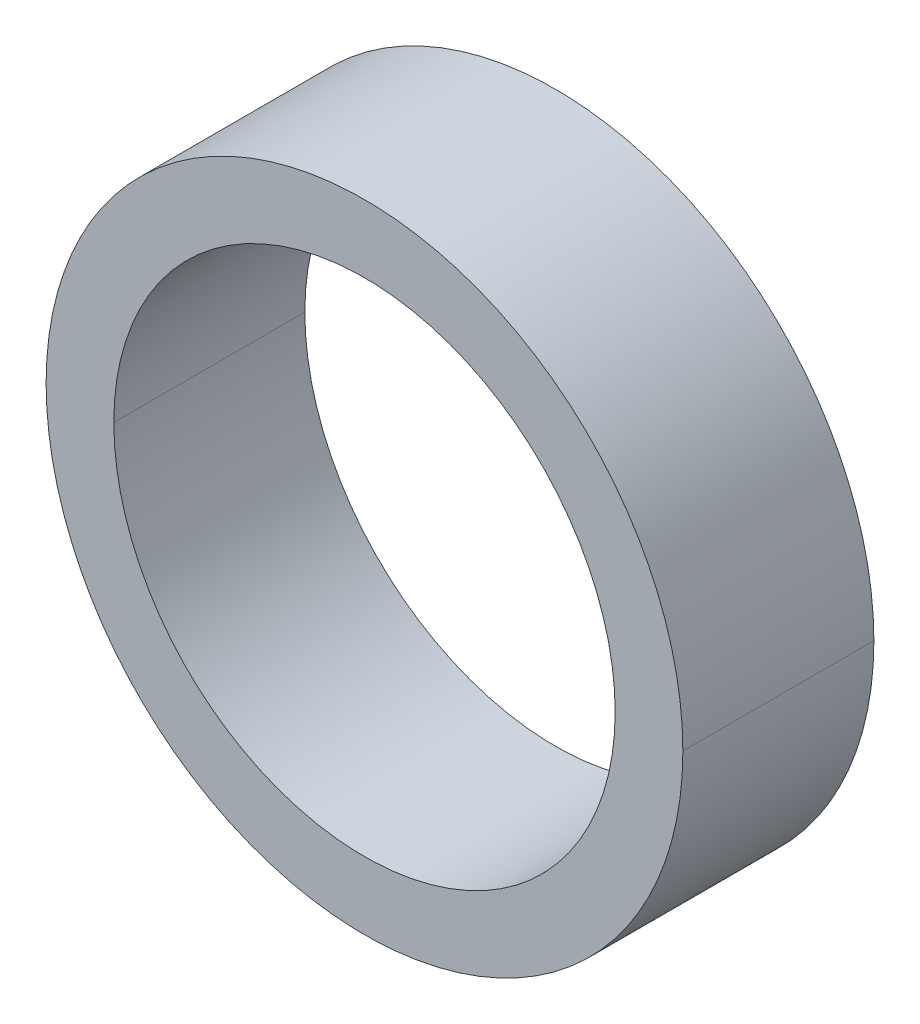
ISO-10303-21;
HEADER;
FILE_DESCRIPTION(('STEP AP214'),'2;1');
FILE_NAME('part.step','',(''),(''),'','','');
FILE_SCHEMA(('AUTOMOTIVE_DESIGN { 1 0 10303 214 1 1 1 1 }'));
ENDSEC;
DATA;
#1=APPLICATION_CONTEXT('core data for automotive mechanical design processes');
#2=APPLICATION_PROTOCOL_DEFINITION('international standard','automotive_design',2000,#1);
#3=PRODUCT_CONTEXT('',#1,'mechanical');
#4=PRODUCT('Part','Part','',(#3));
#5=PRODUCT_RELATED_PRODUCT_CATEGORY('part','',(#4));
#6=PRODUCT_DEFINITION_FORMATION('','',#4);
#7=PRODUCT_DEFINITION_CONTEXT('part definition',#1,'design');
#8=PRODUCT_DEFINITION('design','',#6,#7);
#9=PRODUCT_DEFINITION_SHAPE('','',#8);
#10=(LENGTH_UNIT() NAMED_UNIT(*) SI_UNIT(.MILLI.,.METRE.));
#11=(NAMED_UNIT(*) PLANE_ANGLE_UNIT() SI_UNIT($,.RADIAN.));
#12=(NAMED_UNIT(*) SI_UNIT($,.STERADIAN.) SOLID_ANGLE_UNIT());
#13=UNCERTAINTY_MEASURE_WITH_UNIT(LENGTH_MEASURE(1.E-05),#10,'distance_accuracy_value','');
#14=(GEOMETRIC_REPRESENTATION_CONTEXT(3) GLOBAL_UNCERTAINTY_ASSIGNED_CONTEXT((#13)) GLOBAL_UNIT_ASSIGNED_CONTEXT((#10,
#11,#12)) REPRESENTATION_CONTEXT('',''));
#15=CARTESIAN_POINT('',(0.,0.,0.));
#16=DIRECTION('',(0.,0.,1.));
#17=DIRECTION('',(1.,0.,0.));
#18=AXIS2_PLACEMENT_3D('',#15,#16,#17);
#19=CARTESIAN_POINT('',(0.,0.,7.62));
#20=DIRECTION('',(0.,0.,-1.));
#21=DIRECTION('',(-1.,0.,0.));
#22=AXIS2_PLACEMENT_3D('',#19,#20,#21);
#23=CYLINDRICAL_SURFACE('',#22,10.);
#24=DIRECTION('',(0.,0.,-1.));
#25=VECTOR('',#24,1.);
#26=CARTESIAN_POINT('',(10.,0.,7.62));
#27=LINE('',#26,#25);
#28=CARTESIAN_POINT('',(10.,0.,7.62));
#29=VERTEX_POINT('',#28);
#30=CARTESIAN_POINT('',(10.,0.,0.));
#31=VERTEX_POINT('',#30);
#32=EDGE_CURVE('E74',#29,#31,#27,.T.);
#33=ORIENTED_EDGE('',*,*,#32,.F.);
#34=CARTESIAN_POINT('',(0.,0.,7.62));
#35=DIRECTION('',(0.,0.,1.));
#36=DIRECTION('',(1.,0.,0.));
#37=AXIS2_PLACEMENT_3D('',#34,#35,#36);
#38=CIRCLE('',#37,10.);
#39=CARTESIAN_POINT('',(-10.,0.,7.62));
#40=VERTEX_POINT('',#39);
#41=EDGE_CURVE('E64',#29,#40,#38,.T.);
#42=ORIENTED_EDGE('',*,*,#41,.T.);
#43=DIRECTION('',(0.,0.,-1.));
#44=VECTOR('',#43,1.);
#45=CARTESIAN_POINT('',(-10.,0.,7.62));
#46=LINE('',#45,#44);
#47=CARTESIAN_POINT('',(-10.,0.,0.));
#48=VERTEX_POINT('',#47);
#49=EDGE_CURVE('E77',#40,#48,#46,.T.);
#50=ORIENTED_EDGE('',*,*,#49,.T.);
#51=CARTESIAN_POINT('',(0.,0.,0.));
#52=DIRECTION('',(0.,0.,1.));
#53=DIRECTION('',(1.,0.,0.));
#54=AXIS2_PLACEMENT_3D('',#51,#52,#53);
#55=CIRCLE('',#54,10.);
#56=EDGE_CURVE('E10',#31,#48,#55,.T.);
#57=ORIENTED_EDGE('',*,*,#56,.F.);
#58=EDGE_LOOP('',(#33,#42,#50,#57));
#59=FACE_BOUND('',#58,.T.);
#60=ADVANCED_FACE('F15',(#59),#23,.F.);
#61=CARTESIAN_POINT('',(0.,0.,7.62));
#62=DIRECTION('',(0.,0.,-1.));
#63=DIRECTION('',(-1.,0.,0.));
#64=AXIS2_PLACEMENT_3D('',#61,#62,#63);
#65=CYLINDRICAL_SURFACE('',#64,12.7);
#66=DIRECTION('',(0.,0.,-1.));
#67=VECTOR('',#66,1.);
#68=CARTESIAN_POINT('',(12.7,0.,7.62));
#69=LINE('',#68,#67);
#70=CARTESIAN_POINT('',(12.7,0.,7.62));
#71=VERTEX_POINT('',#70);
#72=CARTESIAN_POINT('',(12.7,0.,0.));
#73=VERTEX_POINT('',#72);
#74=EDGE_CURVE('E19',#71,#73,#69,.T.);
#75=ORIENTED_EDGE('',*,*,#74,.F.);
#76=CARTESIAN_POINT('',(0.,0.,7.62));
#77=DIRECTION('',(0.,0.,1.));
#78=DIRECTION('',(1.,0.,0.));
#79=AXIS2_PLACEMENT_3D('',#76,#77,#78);
#80=CIRCLE('',#79,12.7);
#81=CARTESIAN_POINT('',(-12.7,0.,7.62));
#82=VERTEX_POINT('',#81);
#83=EDGE_CURVE('E103',#82,#71,#80,.T.);
#84=ORIENTED_EDGE('',*,*,#83,.F.);
#85=DIRECTION('',(0.,0.,-1.));
#86=VECTOR('',#85,1.);
#87=CARTESIAN_POINT('',(-12.7,0.,7.62));
#88=LINE('',#87,#86);
#89=CARTESIAN_POINT('',(-12.7,0.,0.));
#90=VERTEX_POINT('',#89);
#91=EDGE_CURVE('E101',#82,#90,#88,.T.);
#92=ORIENTED_EDGE('',*,*,#91,.T.);
#93=CARTESIAN_POINT('',(0.,0.,0.));
#94=DIRECTION('',(0.,0.,1.));
#95=DIRECTION('',(1.,0.,0.));
#96=AXIS2_PLACEMENT_3D('',#93,#94,#95);
#97=CIRCLE('',#96,12.7);
#98=EDGE_CURVE('E26',#90,#73,#97,.T.);
#99=ORIENTED_EDGE('',*,*,#98,.T.);
#100=EDGE_LOOP('',(#75,#84,#92,#99));
#101=FACE_BOUND('',#100,.T.);
#102=ADVANCED_FACE('F166',(#101),#65,.T.);
#103=CARTESIAN_POINT('',(0.,0.,0.));
#104=DIRECTION('',(0.,0.,1.));
#105=DIRECTION('',(1.,0.,0.));
#106=AXIS2_PLACEMENT_3D('',#103,#104,#105);
#107=PLANE('',#106);
#108=CARTESIAN_POINT('',(0.,0.,0.));
#109=DIRECTION('',(0.,0.,1.));
#110=DIRECTION('',(1.,0.,0.));
#111=AXIS2_PLACEMENT_3D('',#108,#109,#110);
#112=CIRCLE('',#111,10.);
#113=EDGE_CURVE('E80',#48,#31,#112,.T.);
#114=ORIENTED_EDGE('',*,*,#113,.T.);
#115=ORIENTED_EDGE('',*,*,#56,.T.);
#116=EDGE_LOOP('',(#114,#115));
#117=FACE_BOUND('',#116,.T.);
#118=ORIENTED_EDGE('',*,*,#98,.F.);
#119=CARTESIAN_POINT('',(0.,0.,0.));
#120=DIRECTION('',(0.,0.,1.));
#121=DIRECTION('',(1.,0.,0.));
#122=AXIS2_PLACEMENT_3D('',#119,#120,#121);
#123=CIRCLE('',#122,12.7);
#124=EDGE_CURVE('E104',#73,#90,#123,.T.);
#125=ORIENTED_EDGE('',*,*,#124,.F.);
#126=EDGE_LOOP('',(#118,#125));
#127=FACE_BOUND('',#126,.T.);
#128=ADVANCED_FACE('F17',(#117,#127),#107,.F.);
#129=CARTESIAN_POINT('',(0.,0.,7.62));
#130=DIRECTION('',(0.,0.,1.));
#131=DIRECTION('',(1.,0.,0.));
#132=AXIS2_PLACEMENT_3D('',#129,#130,#131);
#133=PLANE('',#132);
#134=CARTESIAN_POINT('',(0.,0.,7.62));
#135=DIRECTION('',(0.,0.,1.));
#136=DIRECTION('',(1.,0.,0.));
#137=AXIS2_PLACEMENT_3D('',#134,#135,#136);
#138=CIRCLE('',#137,10.);
#139=EDGE_CURVE('E85',#40,#29,#138,.T.);
#140=ORIENTED_EDGE('',*,*,#139,.F.);
#141=ORIENTED_EDGE('',*,*,#41,.F.);
#142=EDGE_LOOP('',(#140,#141));
#143=FACE_BOUND('',#142,.T.);
#144=ORIENTED_EDGE('',*,*,#83,.T.);
#145=CARTESIAN_POINT('',(0.,0.,7.62));
#146=DIRECTION('',(0.,0.,1.));
#147=DIRECTION('',(1.,0.,0.));
#148=AXIS2_PLACEMENT_3D('',#145,#146,#147);
#149=CIRCLE('',#148,12.7);
#150=EDGE_CURVE('E97',#71,#82,#149,.T.);
#151=ORIENTED_EDGE('',*,*,#150,.T.);
#152=EDGE_LOOP('',(#144,#151));
#153=FACE_BOUND('',#152,.T.);
#154=ADVANCED_FACE('F190',(#143,#153),#133,.T.);
#155=CARTESIAN_POINT('',(0.,0.,7.62));
#156=DIRECTION('',(0.,0.,-1.));
#157=DIRECTION('',(-1.,0.,0.));
#158=AXIS2_PLACEMENT_3D('',#155,#156,#157);
#159=CYLINDRICAL_SURFACE('',#158,12.7);
#160=ORIENTED_EDGE('',*,*,#150,.F.);
#161=ORIENTED_EDGE('',*,*,#74,.T.);
#162=ORIENTED_EDGE('',*,*,#124,.T.);
#163=ORIENTED_EDGE('',*,*,#91,.F.);
#164=EDGE_LOOP('',(#160,#161,#162,#163));
#165=FACE_BOUND('',#164,.T.);
#166=ADVANCED_FACE('F185',(#165),#159,.T.);
#167=CARTESIAN_POINT('',(0.,0.,7.62));
#168=DIRECTION('',(0.,0.,-1.));
#169=DIRECTION('',(-1.,0.,0.));
#170=AXIS2_PLACEMENT_3D('',#167,#168,#169);
#171=CYLINDRICAL_SURFACE('',#170,10.);
#172=ORIENTED_EDGE('',*,*,#139,.T.);
#173=ORIENTED_EDGE('',*,*,#32,.T.);
#174=ORIENTED_EDGE('',*,*,#113,.F.);
#175=ORIENTED_EDGE('',*,*,#49,.F.);
#176=EDGE_LOOP('',(#172,#173,#174,#175));
#177=FACE_BOUND('',#176,.T.);
#178=ADVANCED_FACE('F84',(#177),#171,.F.);
#179=CLOSED_SHELL('',(#60,#102,#128,#154,#166,#178));
#180=MANIFOLD_SOLID_BREP('B1',#179);
#181=ADVANCED_BREP_SHAPE_REPRESENTATION('',(#18,#180),#14);
#182=SHAPE_DEFINITION_REPRESENTATION(#9,#181);
ENDSEC;
END-ISO-10303-21;
